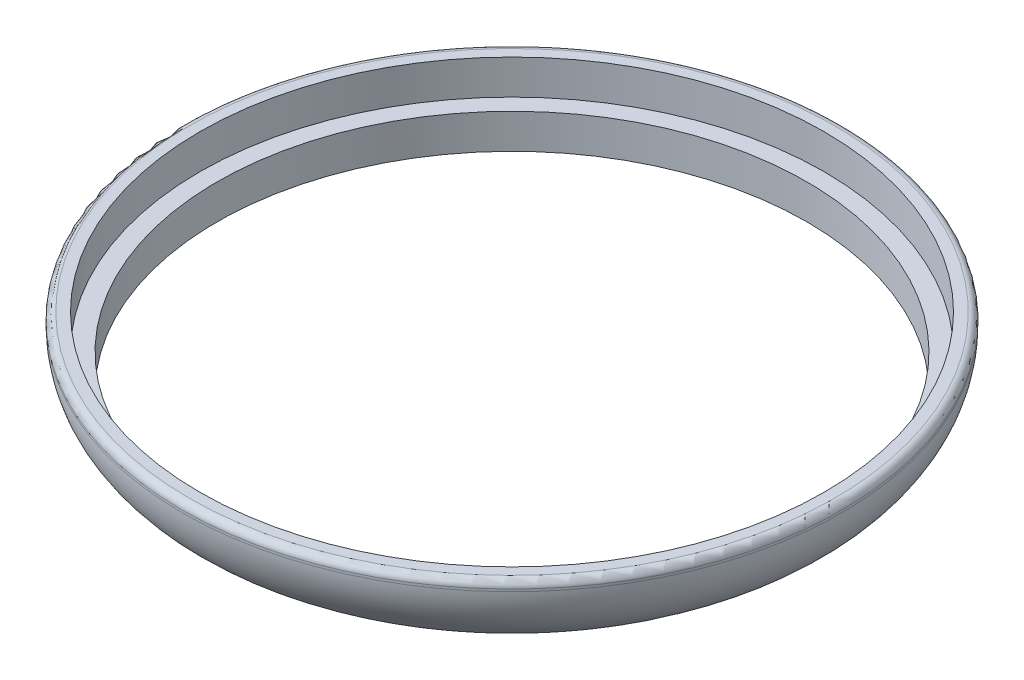
ISO-10303-21;
HEADER;
FILE_DESCRIPTION(('STEP AP214'),'2;1');
FILE_NAME('part.step','',(''),(''),'','','');
FILE_SCHEMA(('AUTOMOTIVE_DESIGN { 1 0 10303 214 1 1 1 1 }'));
ENDSEC;
DATA;
#1=APPLICATION_CONTEXT('core data for automotive mechanical design processes');
#2=APPLICATION_PROTOCOL_DEFINITION('international standard','automotive_design',2000,#1);
#3=PRODUCT_CONTEXT('',#1,'mechanical');
#4=PRODUCT('Part','Part','',(#3));
#5=PRODUCT_RELATED_PRODUCT_CATEGORY('part','',(#4));
#6=PRODUCT_DEFINITION_FORMATION('','',#4);
#7=PRODUCT_DEFINITION_CONTEXT('part definition',#1,'design');
#8=PRODUCT_DEFINITION('design','',#6,#7);
#9=PRODUCT_DEFINITION_SHAPE('','',#8);
#10=(LENGTH_UNIT() NAMED_UNIT(*) SI_UNIT(.MILLI.,.METRE.));
#11=(NAMED_UNIT(*) PLANE_ANGLE_UNIT() SI_UNIT($,.RADIAN.));
#12=(NAMED_UNIT(*) SI_UNIT($,.STERADIAN.) SOLID_ANGLE_UNIT());
#13=UNCERTAINTY_MEASURE_WITH_UNIT(LENGTH_MEASURE(1.E-05),#10,'distance_accuracy_value','');
#14=(GEOMETRIC_REPRESENTATION_CONTEXT(3) GLOBAL_UNCERTAINTY_ASSIGNED_CONTEXT((#13)) GLOBAL_UNIT_ASSIGNED_CONTEXT((#10,
#11,#12)) REPRESENTATION_CONTEXT('',''));
#15=CARTESIAN_POINT('',(0.,0.,0.));
#16=DIRECTION('',(0.,0.,1.));
#17=DIRECTION('',(1.,0.,0.));
#18=AXIS2_PLACEMENT_3D('',#15,#16,#17);
#19=CARTESIAN_POINT('',(0.,1.,0.));
#20=DIRECTION('',(0.,-1.,0.));
#21=DIRECTION('',(0.,0.,-1.));
#22=AXIS2_PLACEMENT_3D('',#19,#20,#21);
#23=CYLINDRICAL_SURFACE('',#22,4.25);
#24=CARTESIAN_POINT('',(0.,0.,0.));
#25=DIRECTION('',(0.,1.,0.));
#26=DIRECTION('',(0.,0.,1.));
#27=AXIS2_PLACEMENT_3D('',#24,#25,#26);
#28=CIRCLE('',#27,4.25);
#29=CARTESIAN_POINT('',(0.,0.,4.25));
#30=VERTEX_POINT('',#29);
#31=EDGE_CURVE('E47',#30,#30,#28,.T.);
#32=ORIENTED_EDGE('',*,*,#31,.F.);
#33=EDGE_LOOP('',(#32));
#34=FACE_BOUND('',#33,.T.);
#35=CARTESIAN_POINT('',(0.,0.5,0.));
#36=DIRECTION('',(0.,1.,0.));
#37=DIRECTION('',(0.,0.,1.));
#38=AXIS2_PLACEMENT_3D('',#35,#36,#37);
#39=CIRCLE('',#38,4.25);
#40=CARTESIAN_POINT('',(0.,0.5,4.25));
#41=VERTEX_POINT('',#40);
#42=EDGE_CURVE('E50',#41,#41,#39,.T.);
#43=ORIENTED_EDGE('',*,*,#42,.T.);
#44=EDGE_LOOP('',(#43));
#45=FACE_BOUND('',#44,.T.);
#46=ADVANCED_FACE('F32',(#34,#45),#23,.F.);
#47=CARTESIAN_POINT('',(0.,1.,0.));
#48=DIRECTION('',(0.,1.,0.));
#49=DIRECTION('',(0.,0.,1.));
#50=AXIS2_PLACEMENT_3D('',#47,#48,#49);
#51=PLANE('',#50);
#52=CARTESIAN_POINT('',(0.,1.,0.));
#53=DIRECTION('',(0.,1.,0.));
#54=DIRECTION('',(0.,0.,1.));
#55=AXIS2_PLACEMENT_3D('',#52,#53,#54);
#56=CIRCLE('',#55,4.65);
#57=CARTESIAN_POINT('',(0.,1.,4.65));
#58=VERTEX_POINT('',#57);
#59=EDGE_CURVE('E39',#58,#58,#56,.T.);
#60=ORIENTED_EDGE('',*,*,#59,.T.);
#61=EDGE_LOOP('',(#60));
#62=FACE_BOUND('',#61,.T.);
#63=CARTESIAN_POINT('',(0.,1.,0.));
#64=DIRECTION('',(0.,1.,0.));
#65=DIRECTION('',(0.,0.,1.));
#66=AXIS2_PLACEMENT_3D('',#63,#64,#65);
#67=CIRCLE('',#66,4.5);
#68=CARTESIAN_POINT('',(0.,1.,4.5));
#69=VERTEX_POINT('',#68);
#70=EDGE_CURVE('E56',#69,#69,#67,.T.);
#71=ORIENTED_EDGE('',*,*,#70,.F.);
#72=EDGE_LOOP('',(#71));
#73=FACE_BOUND('',#72,.T.);
#74=ADVANCED_FACE('F71',(#62,#73),#51,.T.);
#75=CARTESIAN_POINT('',(0.,1.,0.));
#76=DIRECTION('',(0.,-1.,0.));
#77=DIRECTION('',(0.,0.,-1.));
#78=AXIS2_PLACEMENT_3D('',#75,#76,#77);
#79=CYLINDRICAL_SURFACE('',#78,4.75);
#80=CARTESIAN_POINT('',(0.,0.9,0.));
#81=DIRECTION('',(0.,1.,0.));
#82=DIRECTION('',(0.,0.,1.));
#83=AXIS2_PLACEMENT_3D('',#80,#81,#82);
#84=CIRCLE('',#83,4.75);
#85=CARTESIAN_POINT('',(0.,0.9,4.75));
#86=VERTEX_POINT('',#85);
#87=EDGE_CURVE('E10',#86,#86,#84,.F.);
#88=ORIENTED_EDGE('',*,*,#87,.T.);
#89=EDGE_LOOP('',(#88));
#90=FACE_BOUND('',#89,.T.);
#91=CARTESIAN_POINT('',(0.,0.866025403784438,0.));
#92=DIRECTION('',(0.,-1.,0.));
#93=DIRECTION('',(0.,0.,-1.));
#94=AXIS2_PLACEMENT_3D('',#91,#92,#93);
#95=CIRCLE('',#94,4.75);
#96=CARTESIAN_POINT('',(0.,0.866025403784438,-4.75));
#97=VERTEX_POINT('',#96);
#98=EDGE_CURVE('E43',#97,#97,#95,.F.);
#99=ORIENTED_EDGE('',*,*,#98,.T.);
#100=EDGE_LOOP('',(#99));
#101=FACE_BOUND('',#100,.T.);
#102=ADVANCED_FACE('F67',(#90,#101),#79,.T.);
#103=CARTESIAN_POINT('',(0.,0.5,0.));
#104=DIRECTION('',(0.,1.,0.));
#105=DIRECTION('',(0.,0.,1.));
#106=AXIS2_PLACEMENT_3D('',#103,#104,#105);
#107=CYLINDRICAL_SURFACE('',#106,4.5);
#108=CARTESIAN_POINT('',(0.,0.5,0.));
#109=DIRECTION('',(0.,1.,0.));
#110=DIRECTION('',(0.,0.,1.));
#111=AXIS2_PLACEMENT_3D('',#108,#109,#110);
#112=CIRCLE('',#111,4.5);
#113=CARTESIAN_POINT('',(0.,0.5,4.5));
#114=VERTEX_POINT('',#113);
#115=EDGE_CURVE('E53',#114,#114,#112,.T.);
#116=ORIENTED_EDGE('',*,*,#115,.F.);
#117=EDGE_LOOP('',(#116));
#118=FACE_BOUND('',#117,.T.);
#119=ORIENTED_EDGE('',*,*,#70,.T.);
#120=EDGE_LOOP('',(#119));
#121=FACE_BOUND('',#120,.T.);
#122=ADVANCED_FACE('F64',(#118,#121),#107,.F.);
#123=CARTESIAN_POINT('',(0.,0.5,0.));
#124=DIRECTION('',(0.,1.,0.));
#125=DIRECTION('',(0.,0.,1.));
#126=AXIS2_PLACEMENT_3D('',#123,#124,#125);
#127=PLANE('',#126);
#128=ORIENTED_EDGE('',*,*,#42,.F.);
#129=EDGE_LOOP('',(#128));
#130=FACE_BOUND('',#129,.T.);
#131=ORIENTED_EDGE('',*,*,#115,.T.);
#132=EDGE_LOOP('',(#131));
#133=FACE_BOUND('',#132,.T.);
#134=ADVANCED_FACE('F62',(#130,#133),#127,.T.);
#135=CARTESIAN_POINT('',(0.,0.866025403784438,0.));
#136=DIRECTION('',(0.,-1.,0.));
#137=DIRECTION('',(0.,0.,-1.));
#138=AXIS2_PLACEMENT_3D('',#135,#136,#137);
#139=TOROIDAL_SURFACE('',#138,3.75,1.);
#140=ORIENTED_EDGE('',*,*,#31,.T.);
#141=EDGE_LOOP('',(#140));
#142=FACE_BOUND('',#141,.T.);
#143=ORIENTED_EDGE('',*,*,#98,.F.);
#144=EDGE_LOOP('',(#143));
#145=FACE_BOUND('',#144,.T.);
#146=ADVANCED_FACE('F81',(#142,#145),#139,.T.);
#147=CARTESIAN_POINT('',(0.,0.9,0.));
#148=DIRECTION('',(0.,1.,0.));
#149=DIRECTION('',(0.,0.,1.));
#150=AXIS2_PLACEMENT_3D('',#147,#148,#149);
#151=TOROIDAL_SURFACE('',#150,4.65,0.1);
#152=ORIENTED_EDGE('',*,*,#87,.F.);
#153=EDGE_LOOP('',(#152));
#154=FACE_BOUND('',#153,.T.);
#155=ORIENTED_EDGE('',*,*,#59,.F.);
#156=EDGE_LOOP('',(#155));
#157=FACE_BOUND('',#156,.T.);
#158=ADVANCED_FACE('F34',(#154,#157),#151,.T.);
#159=CLOSED_SHELL('',(#46,#74,#102,#122,#134,#146,#158));
#160=MANIFOLD_SOLID_BREP('B2',#159);
#161=ADVANCED_BREP_SHAPE_REPRESENTATION('',(#18,#160),#14);
#162=SHAPE_DEFINITION_REPRESENTATION(#9,#161);
ENDSEC;
END-ISO-10303-21;
